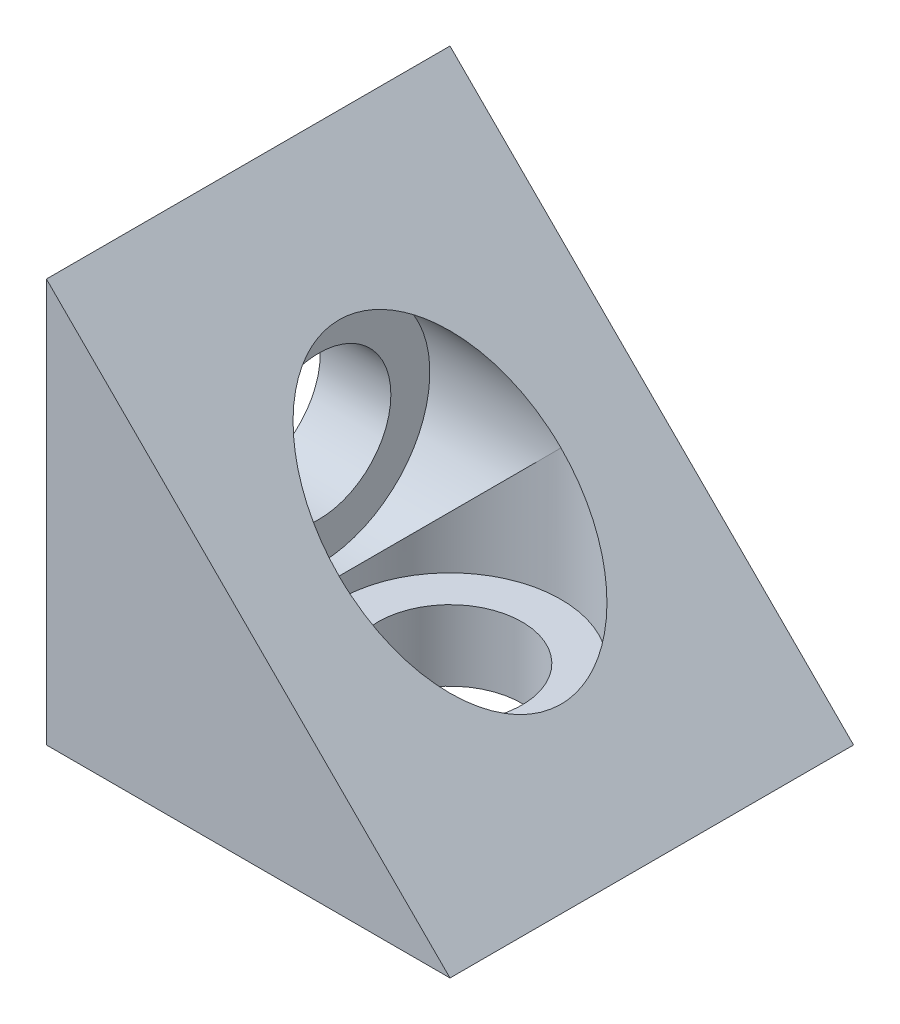
ISO-10303-21;
HEADER;
FILE_DESCRIPTION(('STEP AP214'),'2;1');
FILE_NAME('part.step','',(''),(''),'','','');
FILE_SCHEMA(('AUTOMOTIVE_DESIGN { 1 0 10303 214 1 1 1 1 }'));
ENDSEC;
DATA;
#1=APPLICATION_CONTEXT('core data for automotive mechanical design processes');
#2=APPLICATION_PROTOCOL_DEFINITION('international standard','automotive_design',2000,#1);
#3=PRODUCT_CONTEXT('',#1,'mechanical');
#4=PRODUCT('Part','Part','',(#3));
#5=PRODUCT_RELATED_PRODUCT_CATEGORY('part','',(#4));
#6=PRODUCT_DEFINITION_FORMATION('','',#4);
#7=PRODUCT_DEFINITION_CONTEXT('part definition',#1,'design');
#8=PRODUCT_DEFINITION('design','',#6,#7);
#9=PRODUCT_DEFINITION_SHAPE('','',#8);
#10=(LENGTH_UNIT() NAMED_UNIT(*) SI_UNIT(.MILLI.,.METRE.));
#11=(NAMED_UNIT(*) PLANE_ANGLE_UNIT() SI_UNIT($,.RADIAN.));
#12=(NAMED_UNIT(*) SI_UNIT($,.STERADIAN.) SOLID_ANGLE_UNIT());
#13=UNCERTAINTY_MEASURE_WITH_UNIT(LENGTH_MEASURE(1.E-05),#10,'distance_accuracy_value','');
#14=(GEOMETRIC_REPRESENTATION_CONTEXT(3) GLOBAL_UNCERTAINTY_ASSIGNED_CONTEXT((#13)) GLOBAL_UNIT_ASSIGNED_CONTEXT((#10,
#11,#12)) REPRESENTATION_CONTEXT('',''));
#15=CARTESIAN_POINT('',(0.,0.,0.));
#16=DIRECTION('',(0.,0.,1.));
#17=DIRECTION('',(1.,0.,0.));
#18=AXIS2_PLACEMENT_3D('',#15,#16,#17);
#19=CARTESIAN_POINT('',(0.,10.,10.000000149));
#20=DIRECTION('',(1.,0.,0.));
#21=DIRECTION('',(0.,1.,0.));
#22=AXIS2_PLACEMENT_3D('',#19,#20,#21);
#23=PLANE('',#22);
#24=CARTESIAN_POINT('',(0.,10.0000001490116,10.0000001490116));
#25=DIRECTION('',(1.,0.,0.));
#26=DIRECTION('',(0.,0.,1.));
#27=AXIS2_PLACEMENT_3D('',#24,#25,#26);
#28=CIRCLE('',#27,3.57);
#29=CARTESIAN_POINT('',(0.,10.0000001490116,6.43000014901161));
#30=VERTEX_POINT('',#29);
#31=EDGE_CURVE('E146',#30,#30,#28,.T.);
#32=ORIENTED_EDGE('',*,*,#31,.T.);
#33=EDGE_LOOP('',(#32));
#34=FACE_BOUND('',#33,.T.);
#35=DIRECTION('',(0.,-1.,0.));
#36=VECTOR('',#35,1.);
#37=CARTESIAN_POINT('',(0.,10.,0.));
#38=LINE('',#37,#36);
#39=CARTESIAN_POINT('',(0.,20.,0.));
#40=VERTEX_POINT('',#39);
#41=CARTESIAN_POINT('',(0.,0.,0.));
#42=VERTEX_POINT('',#41);
#43=EDGE_CURVE('E145',#40,#42,#38,.T.);
#44=ORIENTED_EDGE('',*,*,#43,.T.);
#45=DIRECTION('',(0.,0.,-1.));
#46=VECTOR('',#45,1.);
#47=CARTESIAN_POINT('',(0.,0.,10.000000149));
#48=LINE('',#47,#46);
#49=CARTESIAN_POINT('',(0.,0.,20.000000298));
#50=VERTEX_POINT('',#49);
#51=EDGE_CURVE('E11',#50,#42,#48,.T.);
#52=ORIENTED_EDGE('',*,*,#51,.F.);
#53=DIRECTION('',(0.,-1.,0.));
#54=VECTOR('',#53,1.);
#55=CARTESIAN_POINT('',(0.,10.,20.000000298));
#56=LINE('',#55,#54);
#57=CARTESIAN_POINT('',(0.,20.,20.000000298));
#58=VERTEX_POINT('',#57);
#59=EDGE_CURVE('E117',#58,#50,#56,.T.);
#60=ORIENTED_EDGE('',*,*,#59,.F.);
#61=DIRECTION('',(0.,0.,1.));
#62=VECTOR('',#61,1.);
#63=CARTESIAN_POINT('',(0.,20.,10.000000149));
#64=LINE('',#63,#62);
#65=EDGE_CURVE('E111',#40,#58,#64,.T.);
#66=ORIENTED_EDGE('',*,*,#65,.F.);
#67=EDGE_LOOP('',(#44,#52,#60,#66));
#68=FACE_BOUND('',#67,.T.);
#69=ADVANCED_FACE('F17',(#34,#68),#23,.F.);
#70=CARTESIAN_POINT('',(10.000000149,0.,10.000000149));
#71=DIRECTION('',(0.,1.,0.));
#72=DIRECTION('',(1.,0.,0.));
#73=AXIS2_PLACEMENT_3D('',#70,#71,#72);
#74=PLANE('',#73);
#75=CARTESIAN_POINT('',(10.0000001490116,0.,10.0000001490116));
#76=DIRECTION('',(0.,1.,0.));
#77=DIRECTION('',(1.,0.,0.));
#78=AXIS2_PLACEMENT_3D('',#75,#76,#77);
#79=CIRCLE('',#78,3.57);
#80=CARTESIAN_POINT('',(6.43000014901161,0.,10.0000001490116));
#81=VERTEX_POINT('',#80);
#82=EDGE_CURVE('E152',#81,#81,#79,.T.);
#83=ORIENTED_EDGE('',*,*,#82,.T.);
#84=EDGE_LOOP('',(#83));
#85=FACE_BOUND('',#84,.T.);
#86=DIRECTION('',(-1.,0.,0.));
#87=VECTOR('',#86,1.);
#88=CARTESIAN_POINT('',(10.000000149,0.,20.000000298));
#89=LINE('',#88,#87);
#90=CARTESIAN_POINT('',(20.000000298,0.,20.000000298));
#91=VERTEX_POINT('',#90);
#92=EDGE_CURVE('E102',#91,#50,#89,.T.);
#93=ORIENTED_EDGE('',*,*,#92,.T.);
#94=ORIENTED_EDGE('',*,*,#51,.T.);
#95=DIRECTION('',(1.,0.,0.));
#96=VECTOR('',#95,1.);
#97=CARTESIAN_POINT('',(10.000000149,0.,0.));
#98=LINE('',#97,#96);
#99=CARTESIAN_POINT('',(20.000000298,0.,0.));
#100=VERTEX_POINT('',#99);
#101=EDGE_CURVE('E105',#42,#100,#98,.T.);
#102=ORIENTED_EDGE('',*,*,#101,.T.);
#103=DIRECTION('',(0.,0.,1.));
#104=VECTOR('',#103,1.);
#105=CARTESIAN_POINT('',(20.000000298,0.,10.000000149));
#106=LINE('',#105,#104);
#107=EDGE_CURVE('E99',#100,#91,#106,.T.);
#108=ORIENTED_EDGE('',*,*,#107,.T.);
#109=EDGE_LOOP('',(#93,#94,#102,#108));
#110=FACE_BOUND('',#109,.T.);
#111=ADVANCED_FACE('F101',(#85,#110),#74,.F.);
#112=CARTESIAN_POINT('',(3.500000298,10.0000001490116,10.0000001490116));
#113=DIRECTION('',(1.,0.,0.));
#114=DIRECTION('',(0.,1.,0.));
#115=AXIS2_PLACEMENT_3D('',#112,#113,#114);
#116=PLANE('',#115);
#117=CARTESIAN_POINT('',(3.500000298,10.0000001490116,10.0000001490116));
#118=DIRECTION('',(-1.,0.,0.));
#119=DIRECTION('',(0.,0.,1.));
#120=AXIS2_PLACEMENT_3D('',#117,#118,#119);
#121=CIRCLE('',#120,3.57);
#122=CARTESIAN_POINT('',(3.500000298,10.0000001490116,6.43000014901161));
#123=VERTEX_POINT('',#122);
#124=EDGE_CURVE('E27',#123,#123,#121,.T.);
#125=ORIENTED_EDGE('',*,*,#124,.T.);
#126=EDGE_LOOP('',(#125));
#127=FACE_BOUND('',#126,.T.);
#128=CARTESIAN_POINT('',(3.500000298,10.0000001490116,10.0000001490116));
#129=DIRECTION('',(-1.,0.,0.));
#130=DIRECTION('',(0.,0.,-1.));
#131=AXIS2_PLACEMENT_3D('',#128,#129,#130);
#132=CIRCLE('',#131,5.5);
#133=CARTESIAN_POINT('',(3.500000298,10.0000001490116,15.5000001490116));
#134=VERTEX_POINT('',#133);
#135=EDGE_CURVE('E166',#134,#134,#132,.T.);
#136=ORIENTED_EDGE('',*,*,#135,.F.);
#137=EDGE_LOOP('',(#136));
#138=FACE_BOUND('',#137,.T.);
#139=ADVANCED_FACE('F300',(#127,#138),#116,.T.);
#140=CARTESIAN_POINT('',(10.0000001490116,3.5,10.0000001490116));
#141=DIRECTION('',(0.,1.,0.));
#142=DIRECTION('',(1.,0.,0.));
#143=AXIS2_PLACEMENT_3D('',#140,#141,#142);
#144=PLANE('',#143);
#145=CARTESIAN_POINT('',(10.0000001490116,3.5,10.0000001490116));
#146=DIRECTION('',(0.,-1.,0.));
#147=DIRECTION('',(1.,0.,0.));
#148=AXIS2_PLACEMENT_3D('',#145,#146,#147);
#149=CIRCLE('',#148,3.57);
#150=CARTESIAN_POINT('',(6.43000014901161,3.5,10.0000001490116));
#151=VERTEX_POINT('',#150);
#152=EDGE_CURVE('E148',#151,#151,#149,.T.);
#153=ORIENTED_EDGE('',*,*,#152,.T.);
#154=EDGE_LOOP('',(#153));
#155=FACE_BOUND('',#154,.T.);
#156=CARTESIAN_POINT('',(10.0000001490116,3.5,10.0000001490116));
#157=DIRECTION('',(0.,-1.,0.));
#158=DIRECTION('',(-1.,0.,0.));
#159=AXIS2_PLACEMENT_3D('',#156,#157,#158);
#160=CIRCLE('',#159,5.5);
#161=CARTESIAN_POINT('',(15.5000001490116,3.5,10.0000001490116));
#162=VERTEX_POINT('',#161);
#163=EDGE_CURVE('E129',#162,#162,#160,.T.);
#164=ORIENTED_EDGE('',*,*,#163,.F.);
#165=EDGE_LOOP('',(#164));
#166=FACE_BOUND('',#165,.T.);
#167=ADVANCED_FACE('F19',(#155,#166),#144,.T.);
#168=CARTESIAN_POINT('',(0.,10.0000001490116,10.0000001490116));
#169=DIRECTION('',(1.,0.,0.));
#170=DIRECTION('',(0.,0.,1.));
#171=AXIS2_PLACEMENT_3D('',#168,#169,#170);
#172=CYLINDRICAL_SURFACE('',#171,3.57);
#173=ORIENTED_EDGE('',*,*,#31,.F.);
#174=DIRECTION('',(1.,0.,0.));
#175=VECTOR('',#174,1.);
#176=CARTESIAN_POINT('',(0.,10.0000001490116,6.43000014901161));
#177=LINE('',#176,#175);
#178=EDGE_CURVE('E48',#30,#123,#177,.T.);
#179=ORIENTED_EDGE('',*,*,#178,.T.);
#180=ORIENTED_EDGE('',*,*,#124,.F.);
#181=ORIENTED_EDGE('',*,*,#178,.F.);
#182=EDGE_LOOP('',(#173,#179,#180,#181));
#183=FACE_BOUND('',#182,.T.);
#184=ADVANCED_FACE('F197',(#183),#172,.F.);
#185=CARTESIAN_POINT('',(10.0000001490116,0.,10.0000001490116));
#186=DIRECTION('',(0.,1.,0.));
#187=DIRECTION('',(1.,0.,0.));
#188=AXIS2_PLACEMENT_3D('',#185,#186,#187);
#189=CYLINDRICAL_SURFACE('',#188,3.57);
#190=ORIENTED_EDGE('',*,*,#82,.F.);
#191=DIRECTION('',(0.,1.,0.));
#192=VECTOR('',#191,1.);
#193=CARTESIAN_POINT('',(6.43000014901161,0.,10.0000001490116));
#194=LINE('',#193,#192);
#195=EDGE_CURVE('E156',#81,#151,#194,.T.);
#196=ORIENTED_EDGE('',*,*,#195,.T.);
#197=ORIENTED_EDGE('',*,*,#152,.F.);
#198=ORIENTED_EDGE('',*,*,#195,.F.);
#199=EDGE_LOOP('',(#190,#196,#197,#198));
#200=FACE_BOUND('',#199,.T.);
#201=ADVANCED_FACE('F272',(#200),#189,.F.);
#202=CARTESIAN_POINT('',(10.000000149,10.,10.000000149));
#203=DIRECTION('',(-0.707106775918602,-0.707106786454493,0.));
#204=DIRECTION('',(-0.707106786454493,0.707106775918602,0.));
#205=AXIS2_PLACEMENT_3D('',#202,#203,#204);
#206=PLANE('',#205);
#207=CARTESIAN_POINT('',(10.0000001490116,9.99999999998839,10.0000001490116));
#208=DIRECTION('',(-0.707106775918602,-0.707106786454493,0.));
#209=DIRECTION('',(-0.707106786454493,0.707106775918602,0.));
#210=AXIS2_PLACEMENT_3D('',#207,#208,#209);
#211=ELLIPSE('',#210,7.77817453510462,5.5);
#212=CARTESIAN_POINT('',(10.0000000745,10.0000000745,15.5000001490116));
#213=VERTEX_POINT('',#212);
#214=CARTESIAN_POINT('',(10.0000000745,10.0000000745,4.50000014901161));
#215=VERTEX_POINT('',#214);
#216=EDGE_CURVE('E165',#213,#215,#211,.T.);
#217=ORIENTED_EDGE('',*,*,#216,.T.);
#218=CARTESIAN_POINT('',(10.0000001490116,9.99999999998839,10.0000001490116));
#219=DIRECTION('',(-0.707106775918602,-0.707106786454493,0.));
#220=DIRECTION('',(-0.707106786454493,0.707106775918602,0.));
#221=AXIS2_PLACEMENT_3D('',#218,#219,#220);
#222=ELLIPSE('',#221,7.77817453510462,5.5);
#223=CARTESIAN_POINT('',(15.5000001490116,4.50000008193839,10.0000001490116));
#224=VERTEX_POINT('',#223);
#225=EDGE_CURVE('E122',#215,#224,#222,.T.);
#226=ORIENTED_EDGE('',*,*,#225,.T.);
#227=CARTESIAN_POINT('',(10.0000001490116,9.99999999998839,10.0000001490116));
#228=DIRECTION('',(-0.707106775918602,-0.707106786454493,0.));
#229=DIRECTION('',(-0.707106786454493,0.707106775918602,0.));
#230=AXIS2_PLACEMENT_3D('',#227,#228,#229);
#231=ELLIPSE('',#230,7.77817453510462,5.5);
#232=EDGE_CURVE('E159',#224,#213,#231,.T.);
#233=ORIENTED_EDGE('',*,*,#232,.T.);
#234=EDGE_LOOP('',(#217,#226,#233));
#235=FACE_BOUND('',#234,.T.);
#236=ORIENTED_EDGE('',*,*,#107,.F.);
#237=DIRECTION('',(0.707106786454493,-0.707106775918602,0.));
#238=VECTOR('',#237,1.);
#239=CARTESIAN_POINT('',(10.000000149,10.,0.));
#240=LINE('',#239,#238);
#241=EDGE_CURVE('E141',#40,#100,#240,.T.);
#242=ORIENTED_EDGE('',*,*,#241,.F.);
#243=ORIENTED_EDGE('',*,*,#65,.T.);
#244=DIRECTION('',(-0.707106786454493,0.707106775918602,0.));
#245=VECTOR('',#244,1.);
#246=CARTESIAN_POINT('',(10.000000149,10.,20.000000298));
#247=LINE('',#246,#245);
#248=EDGE_CURVE('E21',#91,#58,#247,.T.);
#249=ORIENTED_EDGE('',*,*,#248,.F.);
#250=EDGE_LOOP('',(#236,#242,#243,#249));
#251=FACE_BOUND('',#250,.T.);
#252=ADVANCED_FACE('F120',(#235,#251),#206,.F.);
#253=CARTESIAN_POINT('',(10.000000149,10.,20.000000298));
#254=DIRECTION('',(0.,0.,-1.));
#255=DIRECTION('',(0.,-1.,0.));
#256=AXIS2_PLACEMENT_3D('',#253,#254,#255);
#257=PLANE('',#256);
#258=ORIENTED_EDGE('',*,*,#248,.T.);
#259=ORIENTED_EDGE('',*,*,#59,.T.);
#260=ORIENTED_EDGE('',*,*,#92,.F.);
#261=EDGE_LOOP('',(#258,#259,#260));
#262=FACE_BOUND('',#261,.T.);
#263=ADVANCED_FACE('F115',(#262),#257,.F.);
#264=CARTESIAN_POINT('',(10.0000001490116,20.,10.0000001490116));
#265=DIRECTION('',(0.,-1.,0.));
#266=DIRECTION('',(-1.,0.,0.));
#267=AXIS2_PLACEMENT_3D('',#264,#265,#266);
#268=CYLINDRICAL_SURFACE('',#267,5.5);
#269=CARTESIAN_POINT('',(10.0000001490116,10.0000001490116,10.0000001490116));
#270=DIRECTION('',(0.707106781186548,-0.707106781186548,0.));
#271=DIRECTION('',(-0.707106781186548,-0.707106781186548,0.));
#272=AXIS2_PLACEMENT_3D('',#269,#270,#271);
#273=ELLIPSE('',#272,7.77817459305202,5.5);
#274=EDGE_CURVE('E161',#213,#215,#273,.T.);
#275=ORIENTED_EDGE('',*,*,#274,.F.);
#276=ORIENTED_EDGE('',*,*,#232,.F.);
#277=DIRECTION('',(0.,-1.,0.));
#278=VECTOR('',#277,1.);
#279=CARTESIAN_POINT('',(15.5000001490116,20.,10.0000001490116));
#280=LINE('',#279,#278);
#281=EDGE_CURVE('E137',#224,#162,#280,.T.);
#282=ORIENTED_EDGE('',*,*,#281,.T.);
#283=ORIENTED_EDGE('',*,*,#163,.T.);
#284=ORIENTED_EDGE('',*,*,#281,.F.);
#285=ORIENTED_EDGE('',*,*,#225,.F.);
#286=EDGE_LOOP('',(#275,#276,#282,#283,#284,#285));
#287=FACE_BOUND('',#286,.T.);
#288=ADVANCED_FACE('F266',(#287),#268,.F.);
#289=CARTESIAN_POINT('',(10.000000149,10.,0.));
#290=DIRECTION('',(0.,0.,1.));
#291=DIRECTION('',(1.,0.,0.));
#292=AXIS2_PLACEMENT_3D('',#289,#290,#291);
#293=PLANE('',#292);
#294=ORIENTED_EDGE('',*,*,#241,.T.);
#295=ORIENTED_EDGE('',*,*,#101,.F.);
#296=ORIENTED_EDGE('',*,*,#43,.F.);
#297=EDGE_LOOP('',(#294,#295,#296));
#298=FACE_BOUND('',#297,.T.);
#299=ADVANCED_FACE('F204',(#298),#293,.F.);
#300=CARTESIAN_POINT('',(20.000000298,10.0000001490116,10.0000001490116));
#301=DIRECTION('',(-1.,0.,0.));
#302=DIRECTION('',(0.,0.,-1.));
#303=AXIS2_PLACEMENT_3D('',#300,#301,#302);
#304=CYLINDRICAL_SURFACE('',#303,5.5);
#305=ORIENTED_EDGE('',*,*,#274,.T.);
#306=ORIENTED_EDGE('',*,*,#216,.F.);
#307=DIRECTION('',(-1.,0.,0.));
#308=VECTOR('',#307,1.);
#309=CARTESIAN_POINT('',(20.000000298,10.0000001490116,15.5000001490116));
#310=LINE('',#309,#308);
#311=EDGE_CURVE('E170',#213,#134,#310,.T.);
#312=ORIENTED_EDGE('',*,*,#311,.T.);
#313=ORIENTED_EDGE('',*,*,#135,.T.);
#314=ORIENTED_EDGE('',*,*,#311,.F.);
#315=EDGE_LOOP('',(#305,#306,#312,#313,#314));
#316=FACE_BOUND('',#315,.T.);
#317=ADVANCED_FACE('F265',(#316),#304,.F.);
#318=CLOSED_SHELL('',(#69,#111,#139,#167,#184,#201,#252,#263,#288,#299,#317));
#319=MANIFOLD_SOLID_BREP('B1',#318);
#320=ADVANCED_BREP_SHAPE_REPRESENTATION('',(#18,#319),#14);
#321=SHAPE_DEFINITION_REPRESENTATION(#9,#320);
ENDSEC;
END-ISO-10303-21;
